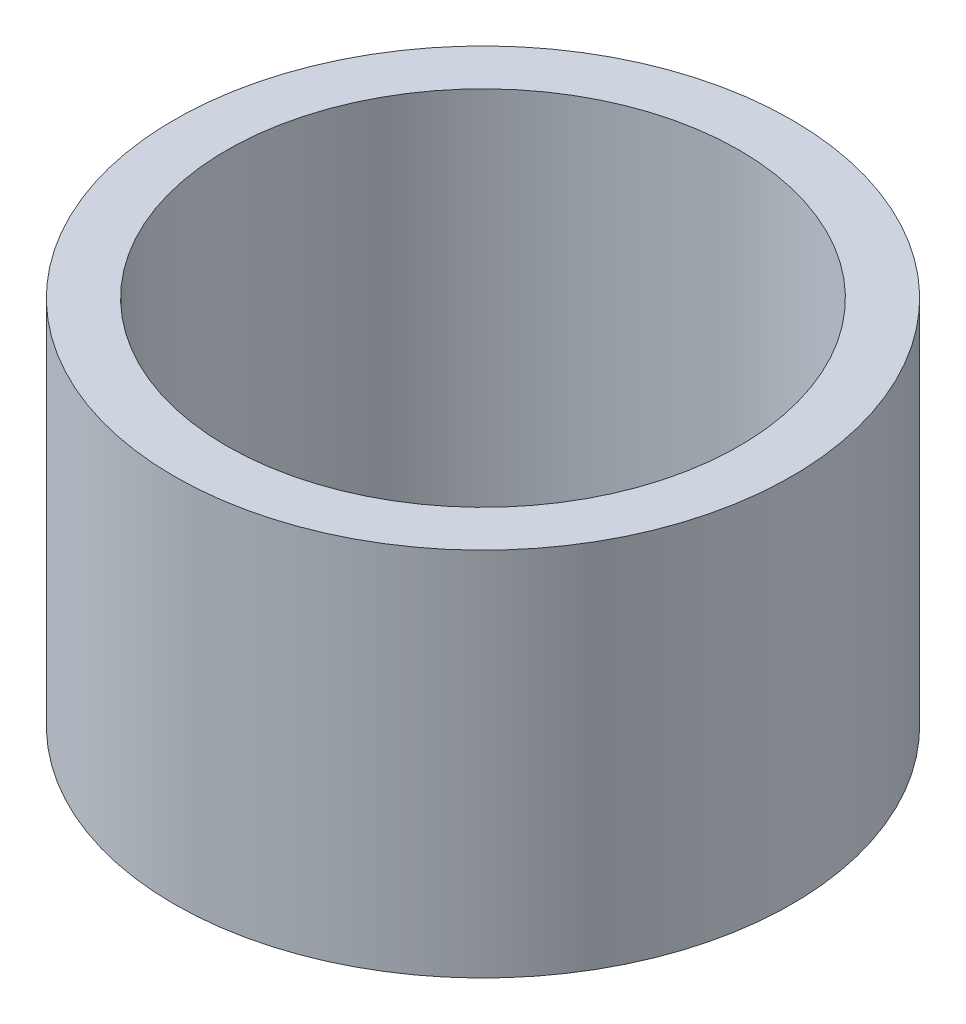
ISO-10303-21;
HEADER;
FILE_DESCRIPTION(('STEP AP214'),'2;1');
FILE_NAME('part.step','',(''),(''),'','','');
FILE_SCHEMA(('AUTOMOTIVE_DESIGN { 1 0 10303 214 1 1 1 1 }'));
ENDSEC;
DATA;
#1=APPLICATION_CONTEXT('core data for automotive mechanical design processes');
#2=APPLICATION_PROTOCOL_DEFINITION('international standard','automotive_design',2000,#1);
#3=PRODUCT_CONTEXT('',#1,'mechanical');
#4=PRODUCT('Part','Part','',(#3));
#5=PRODUCT_RELATED_PRODUCT_CATEGORY('part','',(#4));
#6=PRODUCT_DEFINITION_FORMATION('','',#4);
#7=PRODUCT_DEFINITION_CONTEXT('part definition',#1,'design');
#8=PRODUCT_DEFINITION('design','',#6,#7);
#9=PRODUCT_DEFINITION_SHAPE('','',#8);
#10=(LENGTH_UNIT() NAMED_UNIT(*) SI_UNIT(.MILLI.,.METRE.));
#11=(NAMED_UNIT(*) PLANE_ANGLE_UNIT() SI_UNIT($,.RADIAN.));
#12=(NAMED_UNIT(*) SI_UNIT($,.STERADIAN.) SOLID_ANGLE_UNIT());
#13=UNCERTAINTY_MEASURE_WITH_UNIT(LENGTH_MEASURE(1.E-05),#10,'distance_accuracy_value','');
#14=(GEOMETRIC_REPRESENTATION_CONTEXT(3) GLOBAL_UNCERTAINTY_ASSIGNED_CONTEXT((#13)) GLOBAL_UNIT_ASSIGNED_CONTEXT((#10,
#11,#12)) REPRESENTATION_CONTEXT('',''));
#15=CARTESIAN_POINT('',(0.,0.,0.));
#16=DIRECTION('',(0.,0.,1.));
#17=DIRECTION('',(1.,0.,0.));
#18=AXIS2_PLACEMENT_3D('',#15,#16,#17);
#19=CARTESIAN_POINT('',(0.,0.,0.));
#20=DIRECTION('',(0.,-1.,0.));
#21=DIRECTION('',(0.,0.,-1.));
#22=AXIS2_PLACEMENT_3D('',#19,#20,#21);
#23=PLANE('',#22);
#24=CARTESIAN_POINT('',(0.,0.,0.));
#25=DIRECTION('',(0.,1.,0.));
#26=DIRECTION('',(0.,0.,1.));
#27=AXIS2_PLACEMENT_3D('',#24,#25,#26);
#28=CIRCLE('',#27,8.3);
#29=CARTESIAN_POINT('',(0.,0.,8.3));
#30=VERTEX_POINT('',#29);
#31=EDGE_CURVE('E47',#30,#30,#28,.T.);
#32=ORIENTED_EDGE('',*,*,#31,.T.);
#33=EDGE_LOOP('',(#32));
#34=FACE_BOUND('',#33,.T.);
#35=CARTESIAN_POINT('',(0.,0.,0.));
#36=DIRECTION('',(0.,-1.,0.));
#37=DIRECTION('',(0.,0.,-1.));
#38=AXIS2_PLACEMENT_3D('',#35,#36,#37);
#39=CIRCLE('',#38,10.);
#40=CARTESIAN_POINT('',(0.,0.,-10.));
#41=VERTEX_POINT('',#40);
#42=EDGE_CURVE('E10',#41,#41,#39,.T.);
#43=ORIENTED_EDGE('',*,*,#42,.T.);
#44=EDGE_LOOP('',(#43));
#45=FACE_BOUND('',#44,.T.);
#46=ADVANCED_FACE('F37',(#34,#45),#23,.T.);
#47=CARTESIAN_POINT('',(0.,0.,0.));
#48=DIRECTION('',(0.,-1.,0.));
#49=DIRECTION('',(0.,0.,-1.));
#50=AXIS2_PLACEMENT_3D('',#47,#48,#49);
#51=CYLINDRICAL_SURFACE('',#50,10.);
#52=CARTESIAN_POINT('',(0.,12.,0.));
#53=DIRECTION('',(0.,-1.,0.));
#54=DIRECTION('',(0.,0.,-1.));
#55=AXIS2_PLACEMENT_3D('',#52,#53,#54);
#56=CIRCLE('',#55,10.);
#57=CARTESIAN_POINT('',(0.,12.,-10.));
#58=VERTEX_POINT('',#57);
#59=EDGE_CURVE('E43',#58,#58,#56,.T.);
#60=ORIENTED_EDGE('',*,*,#59,.T.);
#61=EDGE_LOOP('',(#60));
#62=FACE_BOUND('',#61,.T.);
#63=ORIENTED_EDGE('',*,*,#42,.F.);
#64=EDGE_LOOP('',(#63));
#65=FACE_BOUND('',#64,.T.);
#66=ADVANCED_FACE('F62',(#62,#65),#51,.T.);
#67=CARTESIAN_POINT('',(10.,12.,0.));
#68=DIRECTION('',(0.,1.,0.));
#69=DIRECTION('',(0.,0.,1.));
#70=AXIS2_PLACEMENT_3D('',#67,#68,#69);
#71=PLANE('',#70);
#72=CARTESIAN_POINT('',(0.,12.,0.));
#73=DIRECTION('',(0.,1.,0.));
#74=DIRECTION('',(0.,0.,1.));
#75=AXIS2_PLACEMENT_3D('',#72,#73,#74);
#76=CIRCLE('',#75,8.3);
#77=CARTESIAN_POINT('',(0.,12.,8.3));
#78=VERTEX_POINT('',#77);
#79=EDGE_CURVE('E51',#78,#78,#76,.T.);
#80=ORIENTED_EDGE('',*,*,#79,.F.);
#81=EDGE_LOOP('',(#80));
#82=FACE_BOUND('',#81,.T.);
#83=ORIENTED_EDGE('',*,*,#59,.F.);
#84=EDGE_LOOP('',(#83));
#85=FACE_BOUND('',#84,.T.);
#86=ADVANCED_FACE('F59',(#82,#85),#71,.T.);
#87=CARTESIAN_POINT('',(0.,0.,0.));
#88=DIRECTION('',(0.,1.,0.));
#89=DIRECTION('',(0.,0.,1.));
#90=AXIS2_PLACEMENT_3D('',#87,#88,#89);
#91=CYLINDRICAL_SURFACE('',#90,8.3);
#92=ORIENTED_EDGE('',*,*,#31,.F.);
#93=EDGE_LOOP('',(#92));
#94=FACE_BOUND('',#93,.T.);
#95=ORIENTED_EDGE('',*,*,#79,.T.);
#96=EDGE_LOOP('',(#95));
#97=FACE_BOUND('',#96,.T.);
#98=ADVANCED_FACE('F57',(#94,#97),#91,.F.);
#99=CLOSED_SHELL('',(#46,#66,#86,#98));
#100=MANIFOLD_SOLID_BREP('B2',#99);
#101=ADVANCED_BREP_SHAPE_REPRESENTATION('',(#18,#100),#14);
#102=SHAPE_DEFINITION_REPRESENTATION(#9,#101);
ENDSEC;
END-ISO-10303-21;
